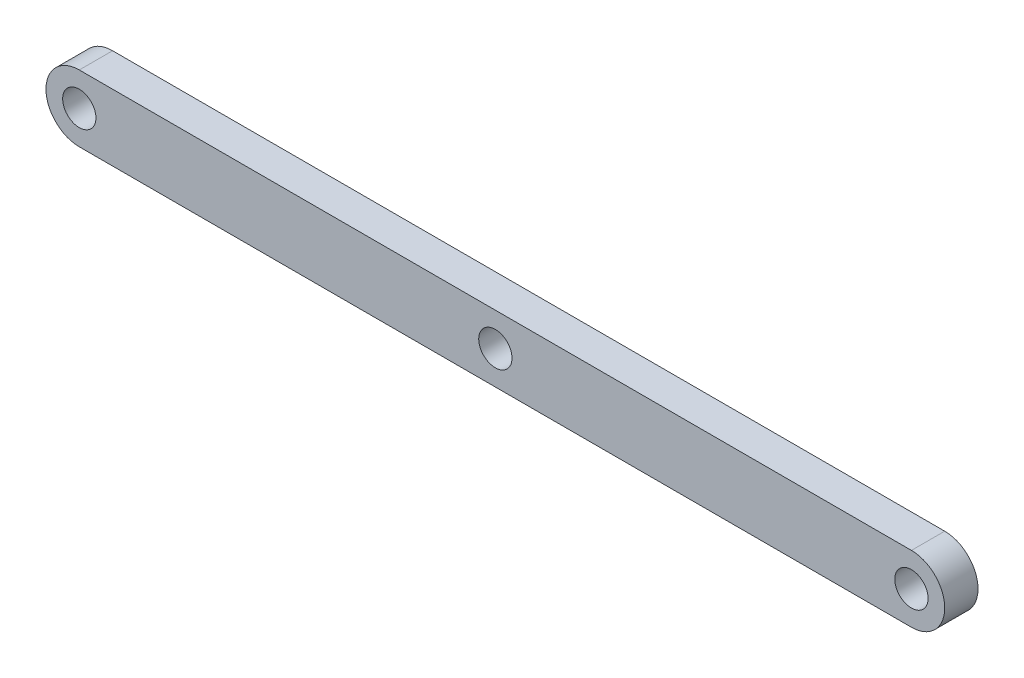
ISO-10303-21;
HEADER;
FILE_DESCRIPTION(('STEP AP214'),'2;1');
FILE_NAME('part.step','',(''),(''),'','','');
FILE_SCHEMA(('AUTOMOTIVE_DESIGN { 1 0 10303 214 1 1 1 1 }'));
ENDSEC;
DATA;
#1=APPLICATION_CONTEXT('core data for automotive mechanical design processes');
#2=APPLICATION_PROTOCOL_DEFINITION('international standard','automotive_design',2000,#1);
#3=PRODUCT_CONTEXT('',#1,'mechanical');
#4=PRODUCT('Part','Part','',(#3));
#5=PRODUCT_RELATED_PRODUCT_CATEGORY('part','',(#4));
#6=PRODUCT_DEFINITION_FORMATION('','',#4);
#7=PRODUCT_DEFINITION_CONTEXT('part definition',#1,'design');
#8=PRODUCT_DEFINITION('design','',#6,#7);
#9=PRODUCT_DEFINITION_SHAPE('','',#8);
#10=(LENGTH_UNIT() NAMED_UNIT(*) SI_UNIT(.MILLI.,.METRE.));
#11=(NAMED_UNIT(*) PLANE_ANGLE_UNIT() SI_UNIT($,.RADIAN.));
#12=(NAMED_UNIT(*) SI_UNIT($,.STERADIAN.) SOLID_ANGLE_UNIT());
#13=UNCERTAINTY_MEASURE_WITH_UNIT(LENGTH_MEASURE(1.E-05),#10,'distance_accuracy_value','');
#14=(GEOMETRIC_REPRESENTATION_CONTEXT(3) GLOBAL_UNCERTAINTY_ASSIGNED_CONTEXT((#13)) GLOBAL_UNIT_ASSIGNED_CONTEXT((#10,
#11,#12)) REPRESENTATION_CONTEXT('',''));
#15=CARTESIAN_POINT('',(0.,0.,0.));
#16=DIRECTION('',(0.,0.,1.));
#17=DIRECTION('',(1.,0.,0.));
#18=AXIS2_PLACEMENT_3D('',#15,#16,#17);
#19=CARTESIAN_POINT('',(-125.,0.,5.));
#20=DIRECTION('',(0.,0.,1.));
#21=DIRECTION('',(1.,0.,0.));
#22=AXIS2_PLACEMENT_3D('',#19,#20,#21);
#23=PLANE('',#22);
#24=CARTESIAN_POINT('',(0.,0.,5.));
#25=DIRECTION('',(0.,0.,1.));
#26=DIRECTION('',(1.,0.,0.));
#27=AXIS2_PLACEMENT_3D('',#24,#25,#26);
#28=CIRCLE('',#27,5.);
#29=CARTESIAN_POINT('',(5.,0.,5.));
#30=VERTEX_POINT('',#29);
#31=EDGE_CURVE('E124',#30,#30,#28,.T.);
#32=ORIENTED_EDGE('',*,*,#31,.F.);
#33=EDGE_LOOP('',(#32));
#34=FACE_BOUND('',#33,.T.);
#35=CARTESIAN_POINT('',(-125.,0.,5.));
#36=DIRECTION('',(0.,0.,1.));
#37=DIRECTION('',(1.,0.,0.));
#38=AXIS2_PLACEMENT_3D('',#35,#36,#37);
#39=CIRCLE('',#38,5.);
#40=CARTESIAN_POINT('',(-120.,0.,5.));
#41=VERTEX_POINT('',#40);
#42=EDGE_CURVE('E100',#41,#41,#39,.T.);
#43=ORIENTED_EDGE('',*,*,#42,.F.);
#44=EDGE_LOOP('',(#43));
#45=FACE_BOUND('',#44,.T.);
#46=CARTESIAN_POINT('',(-125.,0.,5.));
#47=DIRECTION('',(0.,0.,1.));
#48=DIRECTION('',(1.,0.,0.));
#49=AXIS2_PLACEMENT_3D('',#46,#47,#48);
#50=CIRCLE('',#49,10.);
#51=CARTESIAN_POINT('',(-125.,9.99999999999997,5.));
#52=VERTEX_POINT('',#51);
#53=CARTESIAN_POINT('',(-125.,-10.,5.));
#54=VERTEX_POINT('',#53);
#55=EDGE_CURVE('E85',#52,#54,#50,.T.);
#56=ORIENTED_EDGE('',*,*,#55,.T.);
#57=DIRECTION('',(1.,0.,0.));
#58=VECTOR('',#57,1.);
#59=CARTESIAN_POINT('',(-125.,-10.,5.));
#60=LINE('',#59,#58);
#61=CARTESIAN_POINT('',(125.,-9.99999999999996,5.));
#62=VERTEX_POINT('',#61);
#63=EDGE_CURVE('E80',#54,#62,#60,.T.);
#64=ORIENTED_EDGE('',*,*,#63,.T.);
#65=CARTESIAN_POINT('',(125.,0.,5.));
#66=DIRECTION('',(0.,0.,1.));
#67=DIRECTION('',(1.,0.,0.));
#68=AXIS2_PLACEMENT_3D('',#65,#66,#67);
#69=CIRCLE('',#68,10.);
#70=CARTESIAN_POINT('',(125.,10.,5.));
#71=VERTEX_POINT('',#70);
#72=EDGE_CURVE('E83',#62,#71,#69,.T.);
#73=ORIENTED_EDGE('',*,*,#72,.T.);
#74=DIRECTION('',(-1.,0.,0.));
#75=VECTOR('',#74,1.);
#76=CARTESIAN_POINT('',(-125.,9.99999999999997,5.));
#77=LINE('',#76,#75);
#78=EDGE_CURVE('E50',#71,#52,#77,.T.);
#79=ORIENTED_EDGE('',*,*,#78,.T.);
#80=EDGE_LOOP('',(#56,#64,#73,#79));
#81=FACE_BOUND('',#80,.T.);
#82=CARTESIAN_POINT('',(125.,0.,5.));
#83=DIRECTION('',(0.,0.,1.));
#84=DIRECTION('',(1.,0.,0.));
#85=AXIS2_PLACEMENT_3D('',#82,#83,#84);
#86=CIRCLE('',#85,4.99999999999999);
#87=CARTESIAN_POINT('',(130.,0.,5.));
#88=VERTEX_POINT('',#87);
#89=EDGE_CURVE('E115',#88,#88,#86,.T.);
#90=ORIENTED_EDGE('',*,*,#89,.F.);
#91=EDGE_LOOP('',(#90));
#92=FACE_BOUND('',#91,.T.);
#93=ADVANCED_FACE('F33',(#34,#45,#81,#92),#23,.T.);
#94=CARTESIAN_POINT('',(-125.,0.,-5.));
#95=DIRECTION('',(0.,0.,1.));
#96=DIRECTION('',(1.,0.,0.));
#97=AXIS2_PLACEMENT_3D('',#94,#95,#96);
#98=PLANE('',#97);
#99=CARTESIAN_POINT('',(0.,0.,-5.));
#100=DIRECTION('',(0.,0.,1.));
#101=DIRECTION('',(1.,0.,0.));
#102=AXIS2_PLACEMENT_3D('',#99,#100,#101);
#103=CIRCLE('',#102,5.);
#104=CARTESIAN_POINT('',(5.,0.,-5.));
#105=VERTEX_POINT('',#104);
#106=EDGE_CURVE('E121',#105,#105,#103,.T.);
#107=ORIENTED_EDGE('',*,*,#106,.T.);
#108=EDGE_LOOP('',(#107));
#109=FACE_BOUND('',#108,.T.);
#110=CARTESIAN_POINT('',(-125.,0.,-5.));
#111=DIRECTION('',(0.,0.,1.));
#112=DIRECTION('',(1.,0.,0.));
#113=AXIS2_PLACEMENT_3D('',#110,#111,#112);
#114=CIRCLE('',#113,5.);
#115=CARTESIAN_POINT('',(-120.,0.,-5.));
#116=VERTEX_POINT('',#115);
#117=EDGE_CURVE('E112',#116,#116,#114,.T.);
#118=ORIENTED_EDGE('',*,*,#117,.T.);
#119=EDGE_LOOP('',(#118));
#120=FACE_BOUND('',#119,.T.);
#121=CARTESIAN_POINT('',(-125.,0.,-5.));
#122=DIRECTION('',(0.,0.,1.));
#123=DIRECTION('',(1.,0.,0.));
#124=AXIS2_PLACEMENT_3D('',#121,#122,#123);
#125=CIRCLE('',#124,10.);
#126=CARTESIAN_POINT('',(-125.,9.99999999999997,-5.));
#127=VERTEX_POINT('',#126);
#128=CARTESIAN_POINT('',(-125.,-10.,-5.));
#129=VERTEX_POINT('',#128);
#130=EDGE_CURVE('E97',#127,#129,#125,.T.);
#131=ORIENTED_EDGE('',*,*,#130,.F.);
#132=DIRECTION('',(-1.,0.,0.));
#133=VECTOR('',#132,1.);
#134=CARTESIAN_POINT('',(-125.,9.99999999999997,-5.));
#135=LINE('',#134,#133);
#136=CARTESIAN_POINT('',(125.,10.,-5.));
#137=VERTEX_POINT('',#136);
#138=EDGE_CURVE('E73',#137,#127,#135,.T.);
#139=ORIENTED_EDGE('',*,*,#138,.F.);
#140=CARTESIAN_POINT('',(125.,0.,-5.));
#141=DIRECTION('',(0.,0.,1.));
#142=DIRECTION('',(1.,0.,0.));
#143=AXIS2_PLACEMENT_3D('',#140,#141,#142);
#144=CIRCLE('',#143,10.);
#145=CARTESIAN_POINT('',(125.,-9.99999999999996,-5.));
#146=VERTEX_POINT('',#145);
#147=EDGE_CURVE('E67',#146,#137,#144,.T.);
#148=ORIENTED_EDGE('',*,*,#147,.F.);
#149=DIRECTION('',(1.,0.,0.));
#150=VECTOR('',#149,1.);
#151=CARTESIAN_POINT('',(-125.,-10.,-5.));
#152=LINE('',#151,#150);
#153=EDGE_CURVE('E89',#129,#146,#152,.T.);
#154=ORIENTED_EDGE('',*,*,#153,.F.);
#155=EDGE_LOOP('',(#131,#139,#148,#154));
#156=FACE_BOUND('',#155,.T.);
#157=CARTESIAN_POINT('',(125.,0.,-5.));
#158=DIRECTION('',(0.,0.,1.));
#159=DIRECTION('',(1.,0.,0.));
#160=AXIS2_PLACEMENT_3D('',#157,#158,#159);
#161=CIRCLE('',#160,4.99999999999999);
#162=CARTESIAN_POINT('',(130.,0.,-5.));
#163=VERTEX_POINT('',#162);
#164=EDGE_CURVE('E118',#163,#163,#161,.T.);
#165=ORIENTED_EDGE('',*,*,#164,.T.);
#166=EDGE_LOOP('',(#165));
#167=FACE_BOUND('',#166,.T.);
#168=ADVANCED_FACE('F108',(#109,#120,#156,#167),#98,.F.);
#169=CARTESIAN_POINT('',(-125.,0.,5.));
#170=DIRECTION('',(0.,0.,-1.));
#171=DIRECTION('',(-1.,0.,0.));
#172=AXIS2_PLACEMENT_3D('',#169,#170,#171);
#173=CYLINDRICAL_SURFACE('',#172,10.);
#174=ORIENTED_EDGE('',*,*,#130,.T.);
#175=DIRECTION('',(0.,0.,-1.));
#176=VECTOR('',#175,1.);
#177=CARTESIAN_POINT('',(-125.,-10.,5.));
#178=LINE('',#177,#176);
#179=EDGE_CURVE('E11',#54,#129,#178,.T.);
#180=ORIENTED_EDGE('',*,*,#179,.F.);
#181=ORIENTED_EDGE('',*,*,#55,.F.);
#182=DIRECTION('',(0.,0.,-1.));
#183=VECTOR('',#182,1.);
#184=CARTESIAN_POINT('',(-125.,9.99999999999997,5.));
#185=LINE('',#184,#183);
#186=EDGE_CURVE('E93',#52,#127,#185,.T.);
#187=ORIENTED_EDGE('',*,*,#186,.T.);
#188=EDGE_LOOP('',(#174,#180,#181,#187));
#189=FACE_BOUND('',#188,.T.);
#190=ADVANCED_FACE('F35',(#189),#173,.T.);
#191=CARTESIAN_POINT('',(-125.,-10.,5.));
#192=DIRECTION('',(0.,1.,0.));
#193=DIRECTION('',(-1.,0.,0.));
#194=AXIS2_PLACEMENT_3D('',#191,#192,#193);
#195=PLANE('',#194);
#196=ORIENTED_EDGE('',*,*,#153,.T.);
#197=DIRECTION('',(0.,0.,-1.));
#198=VECTOR('',#197,1.);
#199=CARTESIAN_POINT('',(125.,-9.99999999999996,5.));
#200=LINE('',#199,#198);
#201=EDGE_CURVE('E42',#62,#146,#200,.T.);
#202=ORIENTED_EDGE('',*,*,#201,.F.);
#203=ORIENTED_EDGE('',*,*,#63,.F.);
#204=ORIENTED_EDGE('',*,*,#179,.T.);
#205=EDGE_LOOP('',(#196,#202,#203,#204));
#206=FACE_BOUND('',#205,.T.);
#207=ADVANCED_FACE('F88',(#206),#195,.F.);
#208=CARTESIAN_POINT('',(125.,0.,5.));
#209=DIRECTION('',(0.,0.,-1.));
#210=DIRECTION('',(-1.,0.,0.));
#211=AXIS2_PLACEMENT_3D('',#208,#209,#210);
#212=CYLINDRICAL_SURFACE('',#211,10.);
#213=ORIENTED_EDGE('',*,*,#147,.T.);
#214=DIRECTION('',(0.,0.,-1.));
#215=VECTOR('',#214,1.);
#216=CARTESIAN_POINT('',(125.,10.,5.));
#217=LINE('',#216,#215);
#218=EDGE_CURVE('E90',#71,#137,#217,.T.);
#219=ORIENTED_EDGE('',*,*,#218,.F.);
#220=ORIENTED_EDGE('',*,*,#72,.F.);
#221=ORIENTED_EDGE('',*,*,#201,.T.);
#222=EDGE_LOOP('',(#213,#219,#220,#221));
#223=FACE_BOUND('',#222,.T.);
#224=ADVANCED_FACE('F91',(#223),#212,.T.);
#225=CARTESIAN_POINT('',(-125.,9.99999999999997,5.));
#226=DIRECTION('',(0.,-1.,0.));
#227=DIRECTION('',(1.,0.,0.));
#228=AXIS2_PLACEMENT_3D('',#225,#226,#227);
#229=PLANE('',#228);
#230=ORIENTED_EDGE('',*,*,#138,.T.);
#231=ORIENTED_EDGE('',*,*,#186,.F.);
#232=ORIENTED_EDGE('',*,*,#78,.F.);
#233=ORIENTED_EDGE('',*,*,#218,.T.);
#234=EDGE_LOOP('',(#230,#231,#232,#233));
#235=FACE_BOUND('',#234,.T.);
#236=ADVANCED_FACE('F105',(#235),#229,.F.);
#237=CARTESIAN_POINT('',(-125.,0.,5.));
#238=DIRECTION('',(0.,0.,-1.));
#239=DIRECTION('',(-1.,0.,0.));
#240=AXIS2_PLACEMENT_3D('',#237,#238,#239);
#241=CYLINDRICAL_SURFACE('',#240,5.);
#242=ORIENTED_EDGE('',*,*,#42,.T.);
#243=EDGE_LOOP('',(#242));
#244=FACE_BOUND('',#243,.T.);
#245=ORIENTED_EDGE('',*,*,#117,.F.);
#246=EDGE_LOOP('',(#245));
#247=FACE_BOUND('',#246,.T.);
#248=ADVANCED_FACE('F144',(#244,#247),#241,.F.);
#249=CARTESIAN_POINT('',(125.,0.,5.));
#250=DIRECTION('',(0.,0.,-1.));
#251=DIRECTION('',(-1.,0.,0.));
#252=AXIS2_PLACEMENT_3D('',#249,#250,#251);
#253=CYLINDRICAL_SURFACE('',#252,4.99999999999999);
#254=ORIENTED_EDGE('',*,*,#89,.T.);
#255=EDGE_LOOP('',(#254));
#256=FACE_BOUND('',#255,.T.);
#257=ORIENTED_EDGE('',*,*,#164,.F.);
#258=EDGE_LOOP('',(#257));
#259=FACE_BOUND('',#258,.T.);
#260=ADVANCED_FACE('F135',(#256,#259),#253,.F.);
#261=CARTESIAN_POINT('',(0.,0.,-5.));
#262=DIRECTION('',(0.,0.,1.));
#263=DIRECTION('',(1.,0.,0.));
#264=AXIS2_PLACEMENT_3D('',#261,#262,#263);
#265=CYLINDRICAL_SURFACE('',#264,5.);
#266=ORIENTED_EDGE('',*,*,#106,.F.);
#267=EDGE_LOOP('',(#266));
#268=FACE_BOUND('',#267,.T.);
#269=ORIENTED_EDGE('',*,*,#31,.T.);
#270=EDGE_LOOP('',(#269));
#271=FACE_BOUND('',#270,.T.);
#272=ADVANCED_FACE('F132',(#268,#271),#265,.F.);
#273=CLOSED_SHELL('',(#93,#168,#190,#207,#224,#236,#248,#260,#272));
#274=MANIFOLD_SOLID_BREP('B2',#273);
#275=ADVANCED_BREP_SHAPE_REPRESENTATION('',(#18,#274),#14);
#276=SHAPE_DEFINITION_REPRESENTATION(#9,#275);
ENDSEC;
END-ISO-10303-21;
